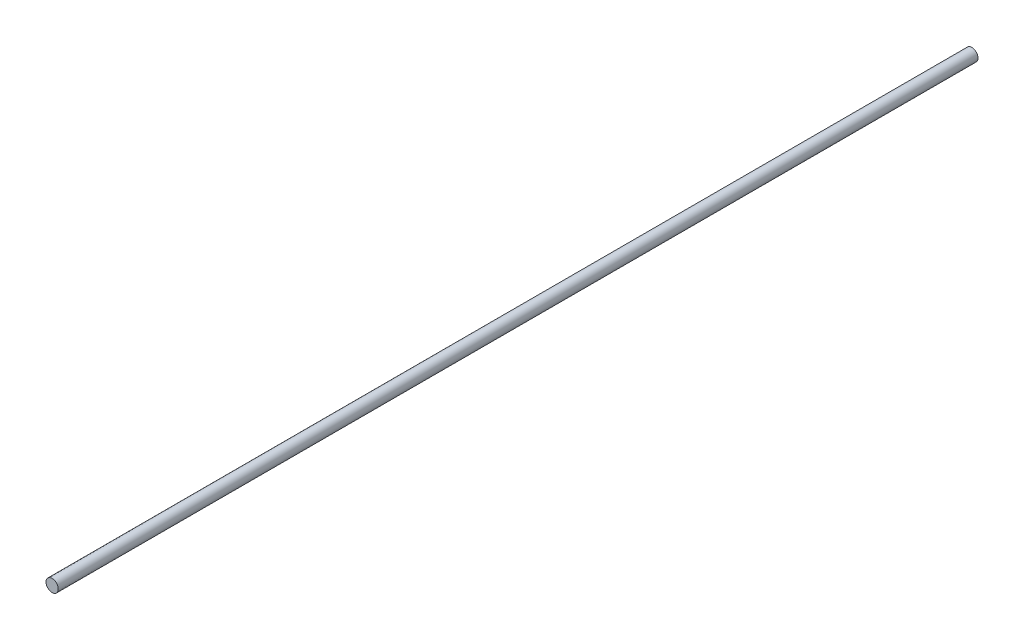
ISO-10303-21;
HEADER;
FILE_DESCRIPTION(('STEP AP214'),'2;1');
FILE_NAME('part.step','',(''),(''),'','','');
FILE_SCHEMA(('AUTOMOTIVE_DESIGN { 1 0 10303 214 1 1 1 1 }'));
ENDSEC;
DATA;
#1=APPLICATION_CONTEXT('core data for automotive mechanical design processes');
#2=APPLICATION_PROTOCOL_DEFINITION('international standard','automotive_design',2000,#1);
#3=PRODUCT_CONTEXT('',#1,'mechanical');
#4=PRODUCT('Part','Part','',(#3));
#5=PRODUCT_RELATED_PRODUCT_CATEGORY('part','',(#4));
#6=PRODUCT_DEFINITION_FORMATION('','',#4);
#7=PRODUCT_DEFINITION_CONTEXT('part definition',#1,'design');
#8=PRODUCT_DEFINITION('design','',#6,#7);
#9=PRODUCT_DEFINITION_SHAPE('','',#8);
#10=(LENGTH_UNIT() NAMED_UNIT(*) SI_UNIT(.MILLI.,.METRE.));
#11=(NAMED_UNIT(*) PLANE_ANGLE_UNIT() SI_UNIT($,.RADIAN.));
#12=(NAMED_UNIT(*) SI_UNIT($,.STERADIAN.) SOLID_ANGLE_UNIT());
#13=UNCERTAINTY_MEASURE_WITH_UNIT(LENGTH_MEASURE(1.E-05),#10,'distance_accuracy_value','');
#14=(GEOMETRIC_REPRESENTATION_CONTEXT(3) GLOBAL_UNCERTAINTY_ASSIGNED_CONTEXT((#13)) GLOBAL_UNIT_ASSIGNED_CONTEXT((#10,
#11,#12)) REPRESENTATION_CONTEXT('',''));
#15=CARTESIAN_POINT('',(0.,0.,0.));
#16=DIRECTION('',(0.,0.,1.));
#17=DIRECTION('',(1.,0.,0.));
#18=AXIS2_PLACEMENT_3D('',#15,#16,#17);
#19=CARTESIAN_POINT('',(0.,0.,600.));
#20=DIRECTION('',(0.,0.,-1.));
#21=DIRECTION('',(-1.,0.,0.));
#22=AXIS2_PLACEMENT_3D('',#19,#20,#21);
#23=CYLINDRICAL_SURFACE('',#22,4.);
#24=CARTESIAN_POINT('',(0.,0.,600.));
#25=DIRECTION('',(0.,0.,1.));
#26=DIRECTION('',(1.,0.,0.));
#27=AXIS2_PLACEMENT_3D('',#24,#25,#26);
#28=CIRCLE('',#27,4.);
#29=CARTESIAN_POINT('',(4.,0.,600.));
#30=VERTEX_POINT('',#29);
#31=EDGE_CURVE('E10',#30,#30,#28,.T.);
#32=ORIENTED_EDGE('',*,*,#31,.F.);
#33=EDGE_LOOP('',(#32));
#34=FACE_BOUND('',#33,.T.);
#35=CARTESIAN_POINT('',(0.,0.,0.));
#36=DIRECTION('',(0.,0.,1.));
#37=DIRECTION('',(1.,0.,0.));
#38=AXIS2_PLACEMENT_3D('',#35,#36,#37);
#39=CIRCLE('',#38,4.);
#40=CARTESIAN_POINT('',(4.,0.,0.));
#41=VERTEX_POINT('',#40);
#42=EDGE_CURVE('E35',#41,#41,#39,.T.);
#43=ORIENTED_EDGE('',*,*,#42,.T.);
#44=EDGE_LOOP('',(#43));
#45=FACE_BOUND('',#44,.T.);
#46=ADVANCED_FACE('F32',(#34,#45),#23,.T.);
#47=CARTESIAN_POINT('',(0.,0.,600.));
#48=DIRECTION('',(0.,0.,1.));
#49=DIRECTION('',(1.,0.,0.));
#50=AXIS2_PLACEMENT_3D('',#47,#48,#49);
#51=PLANE('',#50);
#52=ORIENTED_EDGE('',*,*,#31,.T.);
#53=EDGE_LOOP('',(#52));
#54=FACE_BOUND('',#53,.T.);
#55=ADVANCED_FACE('F47',(#54),#51,.T.);
#56=CARTESIAN_POINT('',(0.,0.,0.));
#57=DIRECTION('',(0.,0.,1.));
#58=DIRECTION('',(1.,0.,0.));
#59=AXIS2_PLACEMENT_3D('',#56,#57,#58);
#60=PLANE('',#59);
#61=ORIENTED_EDGE('',*,*,#42,.F.);
#62=EDGE_LOOP('',(#61));
#63=FACE_BOUND('',#62,.T.);
#64=ADVANCED_FACE('F45',(#63),#60,.F.);
#65=CLOSED_SHELL('',(#46,#55,#64));
#66=MANIFOLD_SOLID_BREP('B2',#65);
#67=ADVANCED_BREP_SHAPE_REPRESENTATION('',(#18,#66),#14);
#68=SHAPE_DEFINITION_REPRESENTATION(#9,#67);
ENDSEC;
END-ISO-10303-21;
